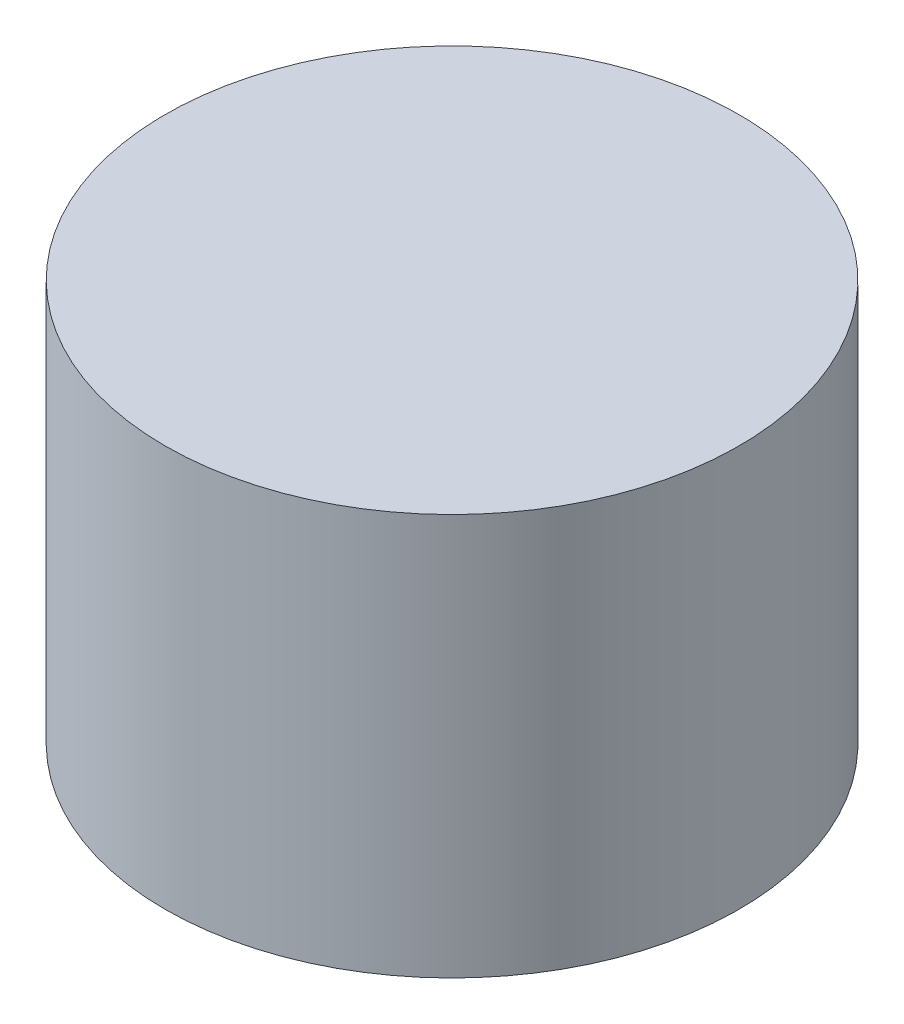
ISO-10303-21;
HEADER;
FILE_DESCRIPTION(('STEP AP214'),'2;1');
FILE_NAME('part.step','',(''),(''),'','','');
FILE_SCHEMA(('AUTOMOTIVE_DESIGN { 1 0 10303 214 1 1 1 1 }'));
ENDSEC;
DATA;
#1=APPLICATION_CONTEXT('core data for automotive mechanical design processes');
#2=APPLICATION_PROTOCOL_DEFINITION('international standard','automotive_design',2000,#1);
#3=PRODUCT_CONTEXT('',#1,'mechanical');
#4=PRODUCT('Part','Part','',(#3));
#5=PRODUCT_RELATED_PRODUCT_CATEGORY('part','',(#4));
#6=PRODUCT_DEFINITION_FORMATION('','',#4);
#7=PRODUCT_DEFINITION_CONTEXT('part definition',#1,'design');
#8=PRODUCT_DEFINITION('design','',#6,#7);
#9=PRODUCT_DEFINITION_SHAPE('','',#8);
#10=(LENGTH_UNIT() NAMED_UNIT(*) SI_UNIT(.MILLI.,.METRE.));
#11=(NAMED_UNIT(*) PLANE_ANGLE_UNIT() SI_UNIT($,.RADIAN.));
#12=(NAMED_UNIT(*) SI_UNIT($,.STERADIAN.) SOLID_ANGLE_UNIT());
#13=UNCERTAINTY_MEASURE_WITH_UNIT(LENGTH_MEASURE(1.E-05),#10,'distance_accuracy_value','');
#14=(GEOMETRIC_REPRESENTATION_CONTEXT(3) GLOBAL_UNCERTAINTY_ASSIGNED_CONTEXT((#13)) GLOBAL_UNIT_ASSIGNED_CONTEXT((#10,
#11,#12)) REPRESENTATION_CONTEXT('',''));
#15=CARTESIAN_POINT('',(0.,0.,0.));
#16=DIRECTION('',(0.,0.,1.));
#17=DIRECTION('',(1.,0.,0.));
#18=AXIS2_PLACEMENT_3D('',#15,#16,#17);
#19=CARTESIAN_POINT('',(0.,10.,0.));
#20=DIRECTION('',(0.,-1.,0.));
#21=DIRECTION('',(0.,0.,-1.));
#22=AXIS2_PLACEMENT_3D('',#19,#20,#21);
#23=CYLINDRICAL_SURFACE('',#22,7.15);
#24=CARTESIAN_POINT('',(0.,10.,0.));
#25=DIRECTION('',(0.,1.,0.));
#26=DIRECTION('',(0.,0.,1.));
#27=AXIS2_PLACEMENT_3D('',#24,#25,#26);
#28=CIRCLE('',#27,7.15);
#29=CARTESIAN_POINT('',(0.,10.,7.15));
#30=VERTEX_POINT('',#29);
#31=EDGE_CURVE('E10',#30,#30,#28,.T.);
#32=ORIENTED_EDGE('',*,*,#31,.F.);
#33=EDGE_LOOP('',(#32));
#34=FACE_BOUND('',#33,.T.);
#35=CARTESIAN_POINT('',(0.,0.,0.));
#36=DIRECTION('',(0.,1.,0.));
#37=DIRECTION('',(0.,0.,1.));
#38=AXIS2_PLACEMENT_3D('',#35,#36,#37);
#39=CIRCLE('',#38,7.15);
#40=CARTESIAN_POINT('',(0.,0.,7.15));
#41=VERTEX_POINT('',#40);
#42=EDGE_CURVE('E46',#41,#41,#39,.T.);
#43=ORIENTED_EDGE('',*,*,#42,.T.);
#44=EDGE_LOOP('',(#43));
#45=FACE_BOUND('',#44,.T.);
#46=ADVANCED_FACE('F43',(#34,#45),#23,.T.);
#47=CARTESIAN_POINT('',(0.,10.,0.));
#48=DIRECTION('',(0.,1.,0.));
#49=DIRECTION('',(0.,0.,1.));
#50=AXIS2_PLACEMENT_3D('',#47,#48,#49);
#51=PLANE('',#50);
#52=ORIENTED_EDGE('',*,*,#31,.T.);
#53=EDGE_LOOP('',(#52));
#54=FACE_BOUND('',#53,.T.);
#55=ADVANCED_FACE('F60',(#54),#51,.T.);
#56=CARTESIAN_POINT('',(0.,0.,0.));
#57=DIRECTION('',(0.,1.,0.));
#58=DIRECTION('',(0.,0.,1.));
#59=AXIS2_PLACEMENT_3D('',#56,#57,#58);
#60=PLANE('',#59);
#61=ORIENTED_EDGE('',*,*,#42,.F.);
#62=EDGE_LOOP('',(#61));
#63=FACE_BOUND('',#62,.T.);
#64=ADVANCED_FACE('F58',(#63),#60,.F.);
#65=CLOSED_SHELL('',(#46,#55,#64));
#66=MANIFOLD_SOLID_BREP('B2',#65);
#67=ADVANCED_BREP_SHAPE_REPRESENTATION('',(#18,#66),#14);
#68=SHAPE_DEFINITION_REPRESENTATION(#9,#67);
ENDSEC;
END-ISO-10303-21;
